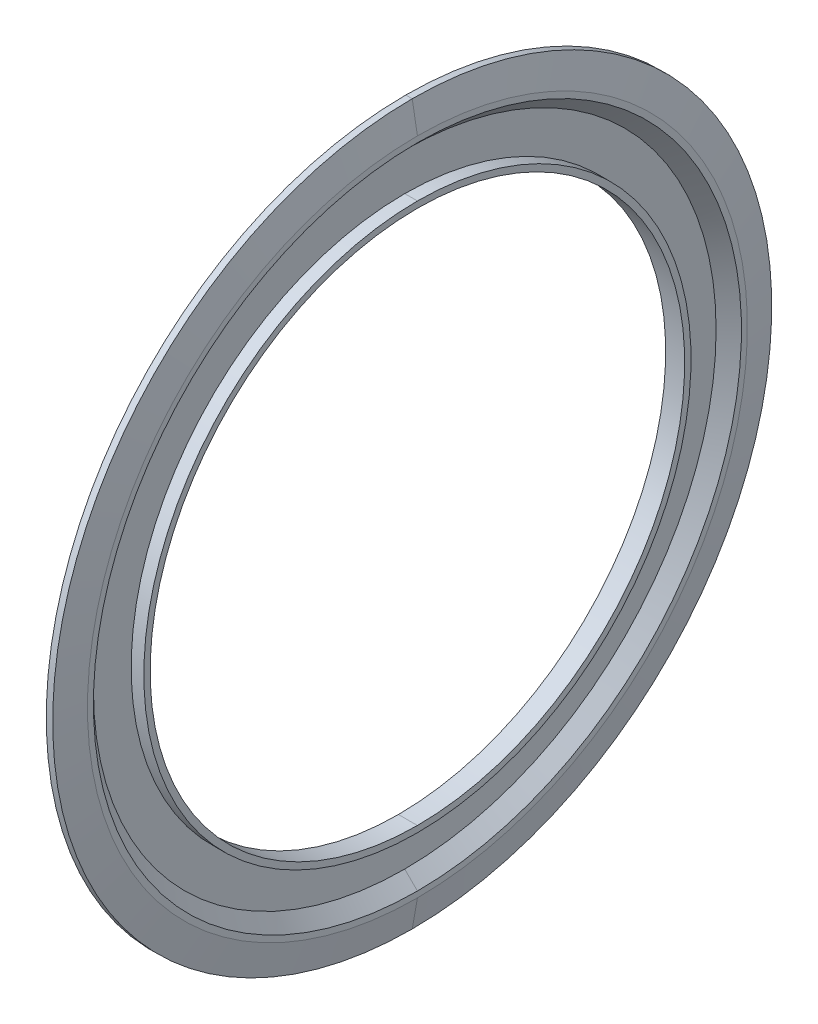
ISO-10303-21;
HEADER;
FILE_DESCRIPTION(('STEP AP214'),'2;1');
FILE_NAME('part.step','',(''),(''),'','','');
FILE_SCHEMA(('AUTOMOTIVE_DESIGN { 1 0 10303 214 1 1 1 1 }'));
ENDSEC;
DATA;
#1=APPLICATION_CONTEXT('core data for automotive mechanical design processes');
#2=APPLICATION_PROTOCOL_DEFINITION('international standard','automotive_design',2000,#1);
#3=PRODUCT_CONTEXT('',#1,'mechanical');
#4=PRODUCT('Part','Part','',(#3));
#5=PRODUCT_RELATED_PRODUCT_CATEGORY('part','',(#4));
#6=PRODUCT_DEFINITION_FORMATION('','',#4);
#7=PRODUCT_DEFINITION_CONTEXT('part definition',#1,'design');
#8=PRODUCT_DEFINITION('design','',#6,#7);
#9=PRODUCT_DEFINITION_SHAPE('','',#8);
#10=(LENGTH_UNIT() NAMED_UNIT(*) SI_UNIT(.MILLI.,.METRE.));
#11=(NAMED_UNIT(*) PLANE_ANGLE_UNIT() SI_UNIT($,.RADIAN.));
#12=(NAMED_UNIT(*) SI_UNIT($,.STERADIAN.) SOLID_ANGLE_UNIT());
#13=UNCERTAINTY_MEASURE_WITH_UNIT(LENGTH_MEASURE(1.E-05),#10,'distance_accuracy_value','');
#14=(GEOMETRIC_REPRESENTATION_CONTEXT(3) GLOBAL_UNCERTAINTY_ASSIGNED_CONTEXT((#13)) GLOBAL_UNIT_ASSIGNED_CONTEXT((#10,
#11,#12)) REPRESENTATION_CONTEXT('',''));
#15=CARTESIAN_POINT('',(0.,0.,0.));
#16=DIRECTION('',(0.,0.,1.));
#17=DIRECTION('',(1.,0.,0.));
#18=AXIS2_PLACEMENT_3D('',#15,#16,#17);
#19=CARTESIAN_POINT('',(0.328621489746741,4.335625,0.));
#20=DIRECTION('',(1.,0.,0.));
#21=DIRECTION('',(0.,0.,1.));
#22=AXIS2_PLACEMENT_3D('',#19,#20,#21);
#23=PLANE('',#22);
#24=CARTESIAN_POINT('',(0.328621489746741,0.,0.));
#25=DIRECTION('',(-1.,0.,0.));
#26=DIRECTION('',(0.,1.,0.));
#27=AXIS2_PLACEMENT_3D('',#24,#25,#26);
#28=CIRCLE('',#27,4.29625);
#29=CARTESIAN_POINT('',(0.328621489746741,4.29625,0.));
#30=VERTEX_POINT('',#29);
#31=CARTESIAN_POINT('',(0.328621489746741,-4.29625,0.));
#32=VERTEX_POINT('',#31);
#33=EDGE_CURVE('E11',#30,#32,#28,.T.);
#34=ORIENTED_EDGE('',*,*,#33,.T.);
#35=CARTESIAN_POINT('',(0.328621489746741,0.,0.));
#36=DIRECTION('',(-1.,0.,0.));
#37=DIRECTION('',(0.,1.,0.));
#38=AXIS2_PLACEMENT_3D('',#35,#36,#37);
#39=CIRCLE('',#38,4.29625);
#40=EDGE_CURVE('E110',#32,#30,#39,.T.);
#41=ORIENTED_EDGE('',*,*,#40,.T.);
#42=EDGE_LOOP('',(#34,#41));
#43=FACE_BOUND('',#42,.T.);
#44=CARTESIAN_POINT('',(0.328621489746741,0.,0.));
#45=DIRECTION('',(-1.,0.,0.));
#46=DIRECTION('',(0.,1.,0.));
#47=AXIS2_PLACEMENT_3D('',#44,#45,#46);
#48=CIRCLE('',#47,4.375);
#49=CARTESIAN_POINT('',(0.328621489746741,4.375,0.));
#50=VERTEX_POINT('',#49);
#51=CARTESIAN_POINT('',(0.328621489746741,-4.375,0.));
#52=VERTEX_POINT('',#51);
#53=EDGE_CURVE('E191',#50,#52,#48,.T.);
#54=ORIENTED_EDGE('',*,*,#53,.F.);
#55=CARTESIAN_POINT('',(0.328621489746741,0.,0.));
#56=DIRECTION('',(-1.,0.,0.));
#57=DIRECTION('',(0.,1.,0.));
#58=AXIS2_PLACEMENT_3D('',#55,#56,#57);
#59=CIRCLE('',#58,4.375);
#60=EDGE_CURVE('E30',#52,#50,#59,.T.);
#61=ORIENTED_EDGE('',*,*,#60,.F.);
#62=EDGE_LOOP('',(#54,#61));
#63=FACE_BOUND('',#62,.T.);
#64=ADVANCED_FACE('F16',(#43,#63),#23,.T.);
#65=CARTESIAN_POINT('',(0.244621489746741,0.,0.));
#66=DIRECTION('',(1.,0.,0.));
#67=DIRECTION('',(0.,1.,0.));
#68=AXIS2_PLACEMENT_3D('',#65,#66,#67);
#69=CONICAL_SURFACE('',#68,4.21225,0.785398163397449);
#70=DIRECTION('',(-0.707106781186547,-0.707106781186548,0.));
#71=VECTOR('',#70,1.);
#72=CARTESIAN_POINT('',(0.244621489746741,4.21225,0.));
#73=LINE('',#72,#71);
#74=CARTESIAN_POINT('',(0.160621489746741,4.12825,0.));
#75=VERTEX_POINT('',#74);
#76=EDGE_CURVE('E105',#30,#75,#73,.T.);
#77=ORIENTED_EDGE('',*,*,#76,.T.);
#78=CARTESIAN_POINT('',(0.160621489746741,0.,0.));
#79=DIRECTION('',(-1.,0.,0.));
#80=DIRECTION('',(0.,1.,0.));
#81=AXIS2_PLACEMENT_3D('',#78,#79,#80);
#82=CIRCLE('',#81,4.12825);
#83=CARTESIAN_POINT('',(0.160621489746741,-4.12825,0.));
#84=VERTEX_POINT('',#83);
#85=EDGE_CURVE('E19',#75,#84,#82,.T.);
#86=ORIENTED_EDGE('',*,*,#85,.T.);
#87=DIRECTION('',(0.707106781186547,-0.707106781186548,0.));
#88=VECTOR('',#87,1.);
#89=CARTESIAN_POINT('',(0.244621489746741,-4.21225,0.));
#90=LINE('',#89,#88);
#91=EDGE_CURVE('E107',#84,#32,#90,.T.);
#92=ORIENTED_EDGE('',*,*,#91,.T.);
#93=ORIENTED_EDGE('',*,*,#33,.F.);
#94=EDGE_LOOP('',(#77,#86,#92,#93));
#95=FACE_BOUND('',#94,.T.);
#96=ADVANCED_FACE('F103',(#95),#69,.F.);
#97=CARTESIAN_POINT('',(0.160621489746741,3.878,0.));
#98=DIRECTION('',(1.,0.,0.));
#99=DIRECTION('',(0.,-1.,0.));
#100=AXIS2_PLACEMENT_3D('',#97,#98,#99);
#101=PLANE('',#100);
#102=CARTESIAN_POINT('',(0.160621489746741,0.,0.));
#103=DIRECTION('',(-1.,0.,0.));
#104=DIRECTION('',(0.,1.,0.));
#105=AXIS2_PLACEMENT_3D('',#102,#103,#104);
#106=CIRCLE('',#105,3.62775);
#107=CARTESIAN_POINT('',(0.160621489746741,3.62775,0.));
#108=VERTEX_POINT('',#107);
#109=CARTESIAN_POINT('',(0.160621489746741,-3.62775,0.));
#110=VERTEX_POINT('',#109);
#111=EDGE_CURVE('E150',#108,#110,#106,.T.);
#112=ORIENTED_EDGE('',*,*,#111,.T.);
#113=CARTESIAN_POINT('',(0.160621489746741,0.,0.));
#114=DIRECTION('',(-1.,0.,0.));
#115=DIRECTION('',(0.,1.,0.));
#116=AXIS2_PLACEMENT_3D('',#113,#114,#115);
#117=CIRCLE('',#116,3.62775);
#118=EDGE_CURVE('E201',#110,#108,#117,.T.);
#119=ORIENTED_EDGE('',*,*,#118,.T.);
#120=EDGE_LOOP('',(#112,#119));
#121=FACE_BOUND('',#120,.T.);
#122=ORIENTED_EDGE('',*,*,#85,.F.);
#123=CARTESIAN_POINT('',(0.160621489746741,0.,0.));
#124=DIRECTION('',(-1.,0.,0.));
#125=DIRECTION('',(0.,1.,0.));
#126=AXIS2_PLACEMENT_3D('',#123,#124,#125);
#127=CIRCLE('',#126,4.12825);
#128=EDGE_CURVE('E116',#84,#75,#127,.T.);
#129=ORIENTED_EDGE('',*,*,#128,.F.);
#130=EDGE_LOOP('',(#122,#129));
#131=FACE_BOUND('',#130,.T.);
#132=ADVANCED_FACE('F205',(#121,#131),#101,.T.);
#133=CARTESIAN_POINT('',(0.244621489746741,0.,0.));
#134=DIRECTION('',(-1.,0.,0.));
#135=DIRECTION('',(0.,1.,0.));
#136=AXIS2_PLACEMENT_3D('',#133,#134,#135);
#137=CYLINDRICAL_SURFACE('',#136,3.62775);
#138=DIRECTION('',(-1.,0.,0.));
#139=VECTOR('',#138,1.);
#140=CARTESIAN_POINT('',(0.244621489746741,3.62775,0.));
#141=LINE('',#140,#139);
#142=CARTESIAN_POINT('',(0.328621489746741,3.62775,0.));
#143=VERTEX_POINT('',#142);
#144=EDGE_CURVE('E132',#143,#108,#141,.T.);
#145=ORIENTED_EDGE('',*,*,#144,.T.);
#146=ORIENTED_EDGE('',*,*,#118,.F.);
#147=DIRECTION('',(1.,0.,0.));
#148=VECTOR('',#147,1.);
#149=CARTESIAN_POINT('',(0.244621489746741,-3.62775,0.));
#150=LINE('',#149,#148);
#151=CARTESIAN_POINT('',(0.328621489746741,-3.62775,0.));
#152=VERTEX_POINT('',#151);
#153=EDGE_CURVE('E138',#110,#152,#150,.T.);
#154=ORIENTED_EDGE('',*,*,#153,.T.);
#155=CARTESIAN_POINT('',(0.328621489746741,0.,0.));
#156=DIRECTION('',(-1.,0.,0.));
#157=DIRECTION('',(0.,1.,0.));
#158=AXIS2_PLACEMENT_3D('',#155,#156,#157);
#159=CIRCLE('',#158,3.62775);
#160=EDGE_CURVE('E200',#152,#143,#159,.T.);
#161=ORIENTED_EDGE('',*,*,#160,.T.);
#162=EDGE_LOOP('',(#145,#146,#154,#161));
#163=FACE_BOUND('',#162,.T.);
#164=ADVANCED_FACE('F207',(#163),#137,.T.);
#165=CARTESIAN_POINT('',(0.328621489746741,3.58575,0.));
#166=DIRECTION('',(1.,0.,0.));
#167=DIRECTION('',(0.,0.,1.));
#168=AXIS2_PLACEMENT_3D('',#165,#166,#167);
#169=PLANE('',#168);
#170=CARTESIAN_POINT('',(0.328621489746741,0.,0.));
#171=DIRECTION('',(-1.,0.,0.));
#172=DIRECTION('',(0.,1.,0.));
#173=AXIS2_PLACEMENT_3D('',#170,#171,#172);
#174=CIRCLE('',#173,3.54375);
#175=CARTESIAN_POINT('',(0.328621489746741,3.54375,0.));
#176=VERTEX_POINT('',#175);
#177=CARTESIAN_POINT('',(0.328621489746741,-3.54375,0.));
#178=VERTEX_POINT('',#177);
#179=EDGE_CURVE('E198',#176,#178,#174,.T.);
#180=ORIENTED_EDGE('',*,*,#179,.T.);
#181=CARTESIAN_POINT('',(0.328621489746741,0.,0.));
#182=DIRECTION('',(-1.,0.,0.));
#183=DIRECTION('',(0.,1.,0.));
#184=AXIS2_PLACEMENT_3D('',#181,#182,#183);
#185=CIRCLE('',#184,3.54375);
#186=EDGE_CURVE('E122',#178,#176,#185,.T.);
#187=ORIENTED_EDGE('',*,*,#186,.T.);
#188=EDGE_LOOP('',(#180,#187));
#189=FACE_BOUND('',#188,.T.);
#190=CARTESIAN_POINT('',(0.328621489746741,0.,0.));
#191=DIRECTION('',(-1.,0.,0.));
#192=DIRECTION('',(0.,1.,0.));
#193=AXIS2_PLACEMENT_3D('',#190,#191,#192);
#194=CIRCLE('',#193,3.62775);
#195=EDGE_CURVE('E135',#143,#152,#194,.T.);
#196=ORIENTED_EDGE('',*,*,#195,.F.);
#197=ORIENTED_EDGE('',*,*,#160,.F.);
#198=EDGE_LOOP('',(#196,#197));
#199=FACE_BOUND('',#198,.T.);
#200=ADVANCED_FACE('F214',(#189,#199),#169,.T.);
#201=CARTESIAN_POINT('',(0.202621489746741,0.,0.));
#202=DIRECTION('',(-1.,0.,0.));
#203=DIRECTION('',(0.,1.,0.));
#204=AXIS2_PLACEMENT_3D('',#201,#202,#203);
#205=CYLINDRICAL_SURFACE('',#204,3.54375);
#206=DIRECTION('',(-1.,0.,0.));
#207=VECTOR('',#206,1.);
#208=CARTESIAN_POINT('',(0.202621489746741,3.54375,0.));
#209=LINE('',#208,#207);
#210=CARTESIAN_POINT('',(0.0766214897467408,3.54375,0.));
#211=VERTEX_POINT('',#210);
#212=EDGE_CURVE('E126',#176,#211,#209,.T.);
#213=ORIENTED_EDGE('',*,*,#212,.T.);
#214=CARTESIAN_POINT('',(0.0766214897467408,0.,0.));
#215=DIRECTION('',(-1.,0.,0.));
#216=DIRECTION('',(0.,1.,0.));
#217=AXIS2_PLACEMENT_3D('',#214,#215,#216);
#218=CIRCLE('',#217,3.54375);
#219=CARTESIAN_POINT('',(0.0766214897467408,-3.54375,0.));
#220=VERTEX_POINT('',#219);
#221=EDGE_CURVE('E141',#211,#220,#218,.T.);
#222=ORIENTED_EDGE('',*,*,#221,.T.);
#223=DIRECTION('',(1.,0.,0.));
#224=VECTOR('',#223,1.);
#225=CARTESIAN_POINT('',(0.202621489746741,-3.54375,0.));
#226=LINE('',#225,#224);
#227=EDGE_CURVE('E125',#220,#178,#226,.T.);
#228=ORIENTED_EDGE('',*,*,#227,.T.);
#229=ORIENTED_EDGE('',*,*,#179,.F.);
#230=EDGE_LOOP('',(#213,#222,#228,#229));
#231=FACE_BOUND('',#230,.T.);
#232=ADVANCED_FACE('F248',(#231),#205,.F.);
#233=CARTESIAN_POINT('',(0.0766214897467408,3.85339696961967,0.));
#234=DIRECTION('',(-1.,0.,0.));
#235=DIRECTION('',(0.,0.,1.));
#236=AXIS2_PLACEMENT_3D('',#233,#234,#235);
#237=PLANE('',#236);
#238=ORIENTED_EDGE('',*,*,#221,.F.);
#239=CARTESIAN_POINT('',(0.0766214897467408,0.,0.));
#240=DIRECTION('',(-1.,0.,0.));
#241=DIRECTION('',(0.,1.,0.));
#242=AXIS2_PLACEMENT_3D('',#239,#240,#241);
#243=CIRCLE('',#242,3.54375);
#244=EDGE_CURVE('E130',#220,#211,#243,.T.);
#245=ORIENTED_EDGE('',*,*,#244,.F.);
#246=EDGE_LOOP('',(#238,#245));
#247=FACE_BOUND('',#246,.T.);
#248=CARTESIAN_POINT('',(0.0766214897467412,0.,0.));
#249=DIRECTION('',(-1.,0.,0.));
#250=DIRECTION('',(0.,1.,0.));
#251=AXIS2_PLACEMENT_3D('',#248,#249,#250);
#252=CIRCLE('',#251,4.16304393923934);
#253=CARTESIAN_POINT('',(0.0766214897467412,4.16304393923934,0.));
#254=VERTEX_POINT('',#253);
#255=CARTESIAN_POINT('',(0.0766214897467412,-4.16304393923934,0.));
#256=VERTEX_POINT('',#255);
#257=EDGE_CURVE('E153',#254,#256,#252,.T.);
#258=ORIENTED_EDGE('',*,*,#257,.T.);
#259=CARTESIAN_POINT('',(0.0766214897467412,0.,0.));
#260=DIRECTION('',(-1.,0.,0.));
#261=DIRECTION('',(0.,1.,0.));
#262=AXIS2_PLACEMENT_3D('',#259,#260,#261);
#263=CIRCLE('',#262,4.16304393923934);
#264=EDGE_CURVE('E139',#256,#254,#263,.T.);
#265=ORIENTED_EDGE('',*,*,#264,.T.);
#266=EDGE_LOOP('',(#258,#265));
#267=FACE_BOUND('',#266,.T.);
#268=ADVANCED_FACE('F258',(#247,#267),#237,.T.);
#269=CARTESIAN_POINT('',(0.160621489746741,0.,0.));
#270=DIRECTION('',(1.,0.,0.));
#271=DIRECTION('',(0.,1.,0.));
#272=AXIS2_PLACEMENT_3D('',#269,#270,#271);
#273=CONICAL_SURFACE('',#272,4.24704393923934,0.785398163397446);
#274=DIRECTION('',(-0.707106781186549,-0.707106781186546,0.));
#275=VECTOR('',#274,1.);
#276=CARTESIAN_POINT('',(0.160621489746741,4.24704393923934,0.));
#277=LINE('',#276,#275);
#278=CARTESIAN_POINT('',(0.244621489746741,4.33104393923934,0.));
#279=VERTEX_POINT('',#278);
#280=EDGE_CURVE('E147',#279,#254,#277,.T.);
#281=ORIENTED_EDGE('',*,*,#280,.T.);
#282=ORIENTED_EDGE('',*,*,#264,.F.);
#283=DIRECTION('',(0.707106781186549,-0.707106781186546,0.));
#284=VECTOR('',#283,1.);
#285=CARTESIAN_POINT('',(0.160621489746741,-4.24704393923934,0.));
#286=LINE('',#285,#284);
#287=CARTESIAN_POINT('',(0.244621489746741,-4.33104393923934,0.));
#288=VERTEX_POINT('',#287);
#289=EDGE_CURVE('E146',#256,#288,#286,.T.);
#290=ORIENTED_EDGE('',*,*,#289,.T.);
#291=CARTESIAN_POINT('',(0.244621489746741,0.,0.));
#292=DIRECTION('',(-1.,0.,0.));
#293=DIRECTION('',(0.,1.,0.));
#294=AXIS2_PLACEMENT_3D('',#291,#292,#293);
#295=CIRCLE('',#294,4.33104393923934);
#296=EDGE_CURVE('E142',#288,#279,#295,.T.);
#297=ORIENTED_EDGE('',*,*,#296,.T.);
#298=EDGE_LOOP('',(#281,#282,#290,#297));
#299=FACE_BOUND('',#298,.T.);
#300=ADVANCED_FACE('F268',(#299),#273,.T.);
#301=CARTESIAN_POINT('',(0.244621489746741,4.34934744575158,0.));
#302=DIRECTION('',(-1.,0.,0.));
#303=DIRECTION('',(0.,0.,1.));
#304=AXIS2_PLACEMENT_3D('',#301,#302,#303);
#305=PLANE('',#304);
#306=CARTESIAN_POINT('',(0.244621489746741,0.,0.));
#307=DIRECTION('',(-1.,0.,0.));
#308=DIRECTION('',(0.,1.,0.));
#309=AXIS2_PLACEMENT_3D('',#306,#307,#308);
#310=CIRCLE('',#309,4.33104393923934);
#311=EDGE_CURVE('E143',#279,#288,#310,.T.);
#312=ORIENTED_EDGE('',*,*,#311,.F.);
#313=ORIENTED_EDGE('',*,*,#296,.F.);
#314=EDGE_LOOP('',(#312,#313));
#315=FACE_BOUND('',#314,.T.);
#316=CARTESIAN_POINT('',(0.244621489746741,0.,0.));
#317=DIRECTION('',(-1.,0.,0.));
#318=DIRECTION('',(0.,1.,0.));
#319=AXIS2_PLACEMENT_3D('',#316,#317,#318);
#320=CIRCLE('',#319,4.36765095226382);
#321=CARTESIAN_POINT('',(0.244621489746741,4.36765095226382,0.));
#322=VERTEX_POINT('',#321);
#323=CARTESIAN_POINT('',(0.244621489746741,-4.36765095226382,0.));
#324=VERTEX_POINT('',#323);
#325=EDGE_CURVE('E119',#322,#324,#320,.T.);
#326=ORIENTED_EDGE('',*,*,#325,.T.);
#327=CARTESIAN_POINT('',(0.244621489746741,0.,0.));
#328=DIRECTION('',(-1.,0.,0.));
#329=DIRECTION('',(0.,1.,0.));
#330=AXIS2_PLACEMENT_3D('',#327,#328,#329);
#331=CIRCLE('',#330,4.36765095226382);
#332=EDGE_CURVE('E169',#324,#322,#331,.T.);
#333=ORIENTED_EDGE('',*,*,#332,.T.);
#334=EDGE_LOOP('',(#326,#333));
#335=FACE_BOUND('',#334,.T.);
#336=ADVANCED_FACE('F278',(#315,#335),#305,.T.);
#337=CARTESIAN_POINT('',(0.20941348382868,0.,0.));
#338=DIRECTION('',(-1.,0.,0.));
#339=DIRECTION('',(0.,1.,0.));
#340=AXIS2_PLACEMENT_3D('',#337,#338,#339);
#341=CONICAL_SURFACE('',#340,4.56732547613191,1.39626340159546);
#342=DIRECTION('',(-0.17364817766693,0.984807753012208,0.));
#343=VECTOR('',#342,1.);
#344=CARTESIAN_POINT('',(0.20941348382868,4.56732547613191,0.));
#345=LINE('',#344,#343);
#346=CARTESIAN_POINT('',(0.17420547791062,4.767,0.));
#347=VERTEX_POINT('',#346);
#348=EDGE_CURVE('E164',#322,#347,#345,.T.);
#349=ORIENTED_EDGE('',*,*,#348,.T.);
#350=CARTESIAN_POINT('',(0.17420547791062,0.,0.));
#351=DIRECTION('',(-1.,0.,0.));
#352=DIRECTION('',(0.,1.,0.));
#353=AXIS2_PLACEMENT_3D('',#350,#351,#352);
#354=CIRCLE('',#353,4.767);
#355=CARTESIAN_POINT('',(0.17420547791062,-4.767,0.));
#356=VERTEX_POINT('',#355);
#357=EDGE_CURVE('E187',#347,#356,#354,.T.);
#358=ORIENTED_EDGE('',*,*,#357,.T.);
#359=DIRECTION('',(0.17364817766693,0.984807753012208,0.));
#360=VECTOR('',#359,1.);
#361=CARTESIAN_POINT('',(0.20941348382868,-4.56732547613191,0.));
#362=LINE('',#361,#360);
#363=EDGE_CURVE('E172',#356,#324,#362,.T.);
#364=ORIENTED_EDGE('',*,*,#363,.T.);
#365=ORIENTED_EDGE('',*,*,#325,.F.);
#366=EDGE_LOOP('',(#349,#358,#364,#365));
#367=FACE_BOUND('',#366,.T.);
#368=ADVANCED_FACE('F288',(#367),#341,.F.);
#369=CARTESIAN_POINT('',(0.216853395609821,0.,0.));
#370=DIRECTION('',(-1.,0.,0.));
#371=DIRECTION('',(0.,1.,0.));
#372=AXIS2_PLACEMENT_3D('',#369,#370,#371);
#373=CYLINDRICAL_SURFACE('',#372,4.767);
#374=DIRECTION('',(-1.,0.,0.));
#375=VECTOR('',#374,1.);
#376=CARTESIAN_POINT('',(0.216853395609821,4.767,0.));
#377=LINE('',#376,#375);
#378=CARTESIAN_POINT('',(0.259501313309022,4.767,0.));
#379=VERTEX_POINT('',#378);
#380=EDGE_CURVE('E178',#379,#347,#377,.T.);
#381=ORIENTED_EDGE('',*,*,#380,.T.);
#382=CARTESIAN_POINT('',(0.17420547791062,0.,0.));
#383=DIRECTION('',(-1.,0.,0.));
#384=DIRECTION('',(0.,1.,0.));
#385=AXIS2_PLACEMENT_3D('',#382,#383,#384);
#386=CIRCLE('',#385,4.767);
#387=EDGE_CURVE('E175',#356,#347,#386,.T.);
#388=ORIENTED_EDGE('',*,*,#387,.F.);
#389=DIRECTION('',(1.,0.,0.));
#390=VECTOR('',#389,1.);
#391=CARTESIAN_POINT('',(0.216853395609821,-4.767,0.));
#392=LINE('',#391,#390);
#393=CARTESIAN_POINT('',(0.259501313309022,-4.767,0.));
#394=VERTEX_POINT('',#393);
#395=EDGE_CURVE('E183',#356,#394,#392,.T.);
#396=ORIENTED_EDGE('',*,*,#395,.T.);
#397=CARTESIAN_POINT('',(0.259501313309022,0.,0.));
#398=DIRECTION('',(-1.,0.,0.));
#399=DIRECTION('',(0.,1.,0.));
#400=AXIS2_PLACEMENT_3D('',#397,#398,#399);
#401=CIRCLE('',#400,4.767);
#402=EDGE_CURVE('E120',#394,#379,#401,.T.);
#403=ORIENTED_EDGE('',*,*,#402,.T.);
#404=EDGE_LOOP('',(#381,#388,#396,#403));
#405=FACE_BOUND('',#404,.T.);
#406=ADVANCED_FACE('F298',(#405),#373,.T.);
#407=CARTESIAN_POINT('',(0.294061401527882,0.,0.));
#408=DIRECTION('',(-1.,0.,0.));
#409=DIRECTION('',(0.,1.,0.));
#410=AXIS2_PLACEMENT_3D('',#407,#408,#409);
#411=CONICAL_SURFACE('',#410,4.571,1.39626340159546);
#412=DIRECTION('',(-0.173648177666931,0.984807753012208,0.));
#413=VECTOR('',#412,1.);
#414=CARTESIAN_POINT('',(0.294061401527882,4.571,0.));
#415=LINE('',#414,#413);
#416=EDGE_CURVE('E189',#50,#379,#415,.T.);
#417=ORIENTED_EDGE('',*,*,#416,.T.);
#418=ORIENTED_EDGE('',*,*,#402,.F.);
#419=DIRECTION('',(0.173648177666931,0.984807753012208,0.));
#420=VECTOR('',#419,1.);
#421=CARTESIAN_POINT('',(0.294061401527882,-4.571,0.));
#422=LINE('',#421,#420);
#423=EDGE_CURVE('E166',#394,#52,#422,.T.);
#424=ORIENTED_EDGE('',*,*,#423,.T.);
#425=ORIENTED_EDGE('',*,*,#60,.T.);
#426=EDGE_LOOP('',(#417,#418,#424,#425));
#427=FACE_BOUND('',#426,.T.);
#428=ADVANCED_FACE('F308',(#427),#411,.T.);
#429=CARTESIAN_POINT('',(0.294061401527882,0.,0.));
#430=DIRECTION('',(-1.,0.,0.));
#431=DIRECTION('',(0.,1.,0.));
#432=AXIS2_PLACEMENT_3D('',#429,#430,#431);
#433=CONICAL_SURFACE('',#432,4.571,1.39626340159546);
#434=ORIENTED_EDGE('',*,*,#416,.F.);
#435=ORIENTED_EDGE('',*,*,#53,.T.);
#436=ORIENTED_EDGE('',*,*,#423,.F.);
#437=CARTESIAN_POINT('',(0.259501313309022,0.,0.));
#438=DIRECTION('',(-1.,0.,0.));
#439=DIRECTION('',(0.,1.,0.));
#440=AXIS2_PLACEMENT_3D('',#437,#438,#439);
#441=CIRCLE('',#440,4.767);
#442=EDGE_CURVE('E181',#379,#394,#441,.T.);
#443=ORIENTED_EDGE('',*,*,#442,.F.);
#444=EDGE_LOOP('',(#434,#435,#436,#443));
#445=FACE_BOUND('',#444,.T.);
#446=ADVANCED_FACE('F318',(#445),#433,.T.);
#447=CARTESIAN_POINT('',(0.216853395609821,0.,0.));
#448=DIRECTION('',(-1.,0.,0.));
#449=DIRECTION('',(0.,1.,0.));
#450=AXIS2_PLACEMENT_3D('',#447,#448,#449);
#451=CYLINDRICAL_SURFACE('',#450,4.767);
#452=ORIENTED_EDGE('',*,*,#380,.F.);
#453=ORIENTED_EDGE('',*,*,#442,.T.);
#454=ORIENTED_EDGE('',*,*,#395,.F.);
#455=ORIENTED_EDGE('',*,*,#357,.F.);
#456=EDGE_LOOP('',(#452,#453,#454,#455));
#457=FACE_BOUND('',#456,.T.);
#458=ADVANCED_FACE('F327',(#457),#451,.T.);
#459=CARTESIAN_POINT('',(0.20941348382868,0.,0.));
#460=DIRECTION('',(-1.,0.,0.));
#461=DIRECTION('',(0.,1.,0.));
#462=AXIS2_PLACEMENT_3D('',#459,#460,#461);
#463=CONICAL_SURFACE('',#462,4.56732547613191,1.39626340159546);
#464=ORIENTED_EDGE('',*,*,#348,.F.);
#465=ORIENTED_EDGE('',*,*,#332,.F.);
#466=ORIENTED_EDGE('',*,*,#363,.F.);
#467=ORIENTED_EDGE('',*,*,#387,.T.);
#468=EDGE_LOOP('',(#464,#465,#466,#467));
#469=FACE_BOUND('',#468,.T.);
#470=ADVANCED_FACE('F337',(#469),#463,.F.);
#471=CARTESIAN_POINT('',(0.160621489746741,0.,0.));
#472=DIRECTION('',(1.,0.,0.));
#473=DIRECTION('',(0.,1.,0.));
#474=AXIS2_PLACEMENT_3D('',#471,#472,#473);
#475=CONICAL_SURFACE('',#474,4.24704393923934,0.785398163397446);
#476=ORIENTED_EDGE('',*,*,#280,.F.);
#477=ORIENTED_EDGE('',*,*,#311,.T.);
#478=ORIENTED_EDGE('',*,*,#289,.F.);
#479=ORIENTED_EDGE('',*,*,#257,.F.);
#480=EDGE_LOOP('',(#476,#477,#478,#479));
#481=FACE_BOUND('',#480,.T.);
#482=ADVANCED_FACE('F347',(#481),#475,.T.);
#483=CARTESIAN_POINT('',(0.202621489746741,0.,0.));
#484=DIRECTION('',(-1.,0.,0.));
#485=DIRECTION('',(0.,1.,0.));
#486=AXIS2_PLACEMENT_3D('',#483,#484,#485);
#487=CYLINDRICAL_SURFACE('',#486,3.54375);
#488=ORIENTED_EDGE('',*,*,#212,.F.);
#489=ORIENTED_EDGE('',*,*,#186,.F.);
#490=ORIENTED_EDGE('',*,*,#227,.F.);
#491=ORIENTED_EDGE('',*,*,#244,.T.);
#492=EDGE_LOOP('',(#488,#489,#490,#491));
#493=FACE_BOUND('',#492,.T.);
#494=ADVANCED_FACE('F357',(#493),#487,.F.);
#495=CARTESIAN_POINT('',(0.244621489746741,0.,0.));
#496=DIRECTION('',(-1.,0.,0.));
#497=DIRECTION('',(0.,1.,0.));
#498=AXIS2_PLACEMENT_3D('',#495,#496,#497);
#499=CYLINDRICAL_SURFACE('',#498,3.62775);
#500=ORIENTED_EDGE('',*,*,#144,.F.);
#501=ORIENTED_EDGE('',*,*,#195,.T.);
#502=ORIENTED_EDGE('',*,*,#153,.F.);
#503=ORIENTED_EDGE('',*,*,#111,.F.);
#504=EDGE_LOOP('',(#500,#501,#502,#503));
#505=FACE_BOUND('',#504,.T.);
#506=ADVANCED_FACE('F367',(#505),#499,.T.);
#507=CARTESIAN_POINT('',(0.244621489746741,0.,0.));
#508=DIRECTION('',(1.,0.,0.));
#509=DIRECTION('',(0.,1.,0.));
#510=AXIS2_PLACEMENT_3D('',#507,#508,#509);
#511=CONICAL_SURFACE('',#510,4.21225,0.785398163397449);
#512=ORIENTED_EDGE('',*,*,#76,.F.);
#513=ORIENTED_EDGE('',*,*,#40,.F.);
#514=ORIENTED_EDGE('',*,*,#91,.F.);
#515=ORIENTED_EDGE('',*,*,#128,.T.);
#516=EDGE_LOOP('',(#512,#513,#514,#515));
#517=FACE_BOUND('',#516,.T.);
#518=ADVANCED_FACE('F114',(#517),#511,.F.);
#519=CLOSED_SHELL('',(#64,#96,#132,#164,#200,#232,#268,#300,#336,#368,#406,#428,#446,#458,#470,
#482,#494,#506,#518));
#520=MANIFOLD_SOLID_BREP('B1',#519);
#521=ADVANCED_BREP_SHAPE_REPRESENTATION('',(#18,#520),#14);
#522=SHAPE_DEFINITION_REPRESENTATION(#9,#521);
ENDSEC;
END-ISO-10303-21;
